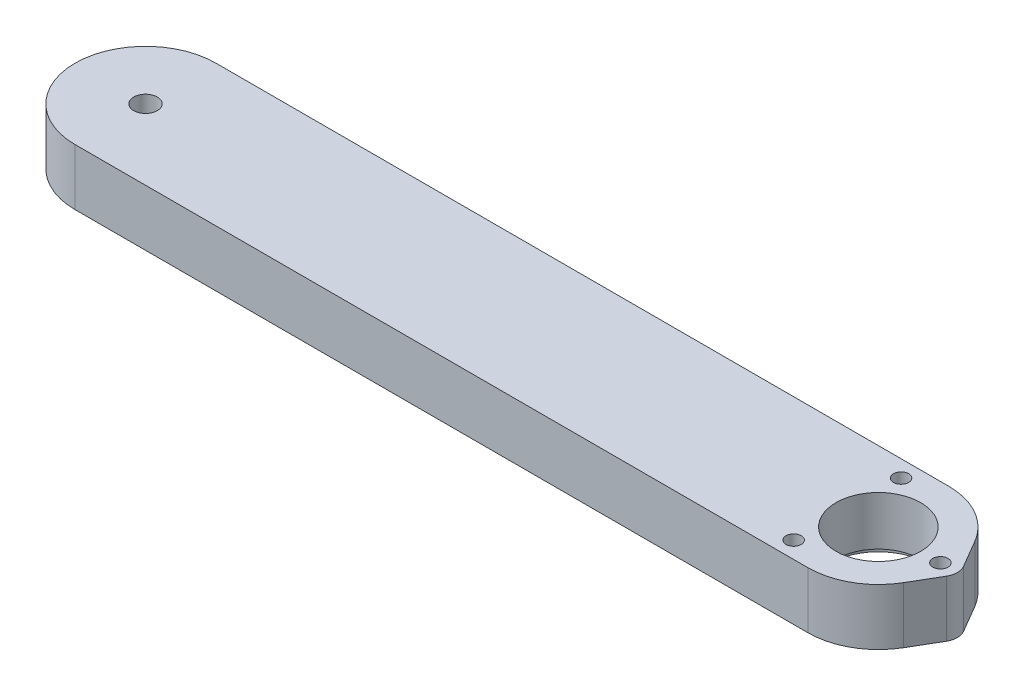
ISO-10303-21;
HEADER;
FILE_DESCRIPTION(('STEP AP214'),'2;1');
FILE_NAME('part.step','',(''),(''),'','','');
FILE_SCHEMA(('AUTOMOTIVE_DESIGN { 1 0 10303 214 1 1 1 1 }'));
ENDSEC;
DATA;
#1=APPLICATION_CONTEXT('core data for automotive mechanical design processes');
#2=APPLICATION_PROTOCOL_DEFINITION('international standard','automotive_design',2000,#1);
#3=PRODUCT_CONTEXT('',#1,'mechanical');
#4=PRODUCT('Part','Part','',(#3));
#5=PRODUCT_RELATED_PRODUCT_CATEGORY('part','',(#4));
#6=PRODUCT_DEFINITION_FORMATION('','',#4);
#7=PRODUCT_DEFINITION_CONTEXT('part definition',#1,'design');
#8=PRODUCT_DEFINITION('design','',#6,#7);
#9=PRODUCT_DEFINITION_SHAPE('','',#8);
#10=(LENGTH_UNIT() NAMED_UNIT(*) SI_UNIT(.MILLI.,.METRE.));
#11=(NAMED_UNIT(*) PLANE_ANGLE_UNIT() SI_UNIT($,.RADIAN.));
#12=(NAMED_UNIT(*) SI_UNIT($,.STERADIAN.) SOLID_ANGLE_UNIT());
#13=UNCERTAINTY_MEASURE_WITH_UNIT(LENGTH_MEASURE(1.E-05),#10,'distance_accuracy_value','');
#14=(GEOMETRIC_REPRESENTATION_CONTEXT(3) GLOBAL_UNCERTAINTY_ASSIGNED_CONTEXT((#13)) GLOBAL_UNIT_ASSIGNED_CONTEXT((#10,
#11,#12)) REPRESENTATION_CONTEXT('',''));
#15=CARTESIAN_POINT('',(0.,0.,0.));
#16=DIRECTION('',(0.,0.,1.));
#17=DIRECTION('',(1.,0.,0.));
#18=AXIS2_PLACEMENT_3D('',#15,#16,#17);
#19=CARTESIAN_POINT('',(65.,10.,0.));
#20=DIRECTION('',(0.,-1.,0.));
#21=DIRECTION('',(0.,0.,-1.));
#22=AXIS2_PLACEMENT_3D('',#19,#20,#21);
#23=CYLINDRICAL_SURFACE('',#22,12.5);
#24=CARTESIAN_POINT('',(65.,10.,0.));
#25=DIRECTION('',(0.,1.,0.));
#26=DIRECTION('',(0.,0.,1.));
#27=AXIS2_PLACEMENT_3D('',#24,#25,#26);
#28=CIRCLE('',#27,12.5);
#29=CARTESIAN_POINT('',(75.7954545454546,10.,-6.30144119682354));
#30=VERTEX_POINT('',#29);
#31=CARTESIAN_POINT('',(65.,10.,-12.5));
#32=VERTEX_POINT('',#31);
#33=EDGE_CURVE('E149',#30,#32,#28,.T.);
#34=ORIENTED_EDGE('',*,*,#33,.F.);
#35=DIRECTION('',(0.,-1.,0.));
#36=VECTOR('',#35,1.);
#37=CARTESIAN_POINT('',(75.7954545454546,23.0039131109965,-6.30144119682354));
#38=LINE('',#37,#36);
#39=CARTESIAN_POINT('',(75.7954545454546,0.,-6.30144119682354));
#40=VERTEX_POINT('',#39);
#41=EDGE_CURVE('E130',#30,#40,#38,.T.);
#42=ORIENTED_EDGE('',*,*,#41,.T.);
#43=CARTESIAN_POINT('',(65.,0.,0.));
#44=DIRECTION('',(0.,1.,0.));
#45=DIRECTION('',(0.,0.,1.));
#46=AXIS2_PLACEMENT_3D('',#43,#44,#45);
#47=CIRCLE('',#46,12.5);
#48=CARTESIAN_POINT('',(65.,0.,-12.5));
#49=VERTEX_POINT('',#48);
#50=EDGE_CURVE('E158',#40,#49,#47,.T.);
#51=ORIENTED_EDGE('',*,*,#50,.T.);
#52=DIRECTION('',(0.,-1.,0.));
#53=VECTOR('',#52,1.);
#54=CARTESIAN_POINT('',(65.,10.,-12.5));
#55=LINE('',#54,#53);
#56=EDGE_CURVE('E164',#32,#49,#55,.T.);
#57=ORIENTED_EDGE('',*,*,#56,.F.);
#58=EDGE_LOOP('',(#34,#42,#51,#57));
#59=FACE_BOUND('',#58,.T.);
#60=ADVANCED_FACE('F37',(#59),#23,.T.);
#61=CARTESIAN_POINT('',(-65.,10.,0.));
#62=DIRECTION('',(0.,-1.,0.));
#63=DIRECTION('',(0.,0.,-1.));
#64=AXIS2_PLACEMENT_3D('',#61,#62,#63);
#65=CYLINDRICAL_SURFACE('',#64,12.5);
#66=CARTESIAN_POINT('',(-65.,0.,0.));
#67=DIRECTION('',(0.,1.,0.));
#68=DIRECTION('',(0.,0.,1.));
#69=AXIS2_PLACEMENT_3D('',#66,#67,#68);
#70=CIRCLE('',#69,12.5);
#71=CARTESIAN_POINT('',(-65.,0.,-12.5));
#72=VERTEX_POINT('',#71);
#73=CARTESIAN_POINT('',(-65.,0.,12.5));
#74=VERTEX_POINT('',#73);
#75=EDGE_CURVE('E145',#72,#74,#70,.T.);
#76=ORIENTED_EDGE('',*,*,#75,.T.);
#77=DIRECTION('',(0.,-1.,0.));
#78=VECTOR('',#77,1.);
#79=CARTESIAN_POINT('',(-65.,10.,12.5));
#80=LINE('',#79,#78);
#81=CARTESIAN_POINT('',(-65.,10.,12.5));
#82=VERTEX_POINT('',#81);
#83=EDGE_CURVE('E11',#82,#74,#80,.T.);
#84=ORIENTED_EDGE('',*,*,#83,.F.);
#85=CARTESIAN_POINT('',(-65.,10.,0.));
#86=DIRECTION('',(0.,1.,0.));
#87=DIRECTION('',(0.,0.,1.));
#88=AXIS2_PLACEMENT_3D('',#85,#86,#87);
#89=CIRCLE('',#88,12.5);
#90=CARTESIAN_POINT('',(-65.,10.,-12.5));
#91=VERTEX_POINT('',#90);
#92=EDGE_CURVE('E146',#91,#82,#89,.T.);
#93=ORIENTED_EDGE('',*,*,#92,.F.);
#94=DIRECTION('',(0.,-1.,0.));
#95=VECTOR('',#94,1.);
#96=CARTESIAN_POINT('',(-65.,10.,-12.5));
#97=LINE('',#96,#95);
#98=EDGE_CURVE('E153',#91,#72,#97,.T.);
#99=ORIENTED_EDGE('',*,*,#98,.T.);
#100=EDGE_LOOP('',(#76,#84,#93,#99));
#101=FACE_BOUND('',#100,.T.);
#102=ADVANCED_FACE('F39',(#101),#65,.T.);
#103=CARTESIAN_POINT('',(-65.,10.,12.5));
#104=DIRECTION('',(0.,0.,-1.));
#105=DIRECTION('',(-1.,0.,0.));
#106=AXIS2_PLACEMENT_3D('',#103,#104,#105);
#107=PLANE('',#106);
#108=DIRECTION('',(1.,0.,0.));
#109=VECTOR('',#108,1.);
#110=CARTESIAN_POINT('',(-65.,0.,12.5));
#111=LINE('',#110,#109);
#112=CARTESIAN_POINT('',(65.,0.,12.5));
#113=VERTEX_POINT('',#112);
#114=EDGE_CURVE('E156',#74,#113,#111,.T.);
#115=ORIENTED_EDGE('',*,*,#114,.T.);
#116=DIRECTION('',(0.,-1.,0.));
#117=VECTOR('',#116,1.);
#118=CARTESIAN_POINT('',(65.,10.,12.5));
#119=LINE('',#118,#117);
#120=CARTESIAN_POINT('',(65.,10.,12.5));
#121=VERTEX_POINT('',#120);
#122=EDGE_CURVE('E46',#121,#113,#119,.T.);
#123=ORIENTED_EDGE('',*,*,#122,.F.);
#124=DIRECTION('',(1.,0.,0.));
#125=VECTOR('',#124,1.);
#126=CARTESIAN_POINT('',(-65.,10.,12.5));
#127=LINE('',#126,#125);
#128=EDGE_CURVE('E90',#82,#121,#127,.T.);
#129=ORIENTED_EDGE('',*,*,#128,.F.);
#130=ORIENTED_EDGE('',*,*,#83,.T.);
#131=EDGE_LOOP('',(#115,#123,#129,#130));
#132=FACE_BOUND('',#131,.T.);
#133=ADVANCED_FACE('F180',(#132),#107,.F.);
#134=CARTESIAN_POINT('',(75.7954545454546,0.,6.30144119682354));
#135=VERTEX_POINT('',#134);
#136=EDGE_CURVE('E159',#113,#135,#47,.T.);
#137=ORIENTED_EDGE('',*,*,#136,.T.);
#138=DIRECTION('',(0.,-1.,0.));
#139=VECTOR('',#138,1.);
#140=CARTESIAN_POINT('',(75.7954545454546,23.0039131109965,6.30144119682354));
#141=LINE('',#140,#139);
#142=CARTESIAN_POINT('',(75.7954545454546,10.,6.30144119682352));
#143=VERTEX_POINT('',#142);
#144=EDGE_CURVE('E140',#143,#135,#141,.T.);
#145=ORIENTED_EDGE('',*,*,#144,.F.);
#146=EDGE_CURVE('E150',#121,#143,#28,.T.);
#147=ORIENTED_EDGE('',*,*,#146,.F.);
#148=ORIENTED_EDGE('',*,*,#122,.T.);
#149=EDGE_LOOP('',(#137,#145,#147,#148));
#150=FACE_BOUND('',#149,.T.);
#151=ADVANCED_FACE('F170',(#150),#23,.T.);
#152=CARTESIAN_POINT('',(-65.,10.,-12.5));
#153=DIRECTION('',(0.,0.,1.));
#154=DIRECTION('',(1.,0.,0.));
#155=AXIS2_PLACEMENT_3D('',#152,#153,#154);
#156=PLANE('',#155);
#157=DIRECTION('',(-1.,0.,0.));
#158=VECTOR('',#157,1.);
#159=CARTESIAN_POINT('',(-65.,0.,-12.5));
#160=LINE('',#159,#158);
#161=EDGE_CURVE('E83',#49,#72,#160,.T.);
#162=ORIENTED_EDGE('',*,*,#161,.T.);
#163=ORIENTED_EDGE('',*,*,#98,.F.);
#164=DIRECTION('',(-1.,0.,0.));
#165=VECTOR('',#164,1.);
#166=CARTESIAN_POINT('',(-65.,10.,-12.5));
#167=LINE('',#166,#165);
#168=EDGE_CURVE('E62',#32,#91,#167,.T.);
#169=ORIENTED_EDGE('',*,*,#168,.F.);
#170=ORIENTED_EDGE('',*,*,#56,.T.);
#171=EDGE_LOOP('',(#162,#163,#169,#170));
#172=FACE_BOUND('',#171,.T.);
#173=ADVANCED_FACE('F186',(#172),#156,.F.);
#174=CARTESIAN_POINT('',(-65.,10.,0.));
#175=DIRECTION('',(0.,1.,0.));
#176=DIRECTION('',(0.,0.,1.));
#177=AXIS2_PLACEMENT_3D('',#174,#175,#176);
#178=PLANE('',#177);
#179=CARTESIAN_POINT('',(-65.,10.,0.));
#180=DIRECTION('',(0.,1.,0.));
#181=DIRECTION('',(0.,0.,1.));
#182=AXIS2_PLACEMENT_3D('',#179,#180,#181);
#183=CIRCLE('',#182,2.1);
#184=CARTESIAN_POINT('',(-65.,10.,2.1));
#185=VERTEX_POINT('',#184);
#186=EDGE_CURVE('E239',#185,#185,#183,.T.);
#187=ORIENTED_EDGE('',*,*,#186,.F.);
#188=EDGE_LOOP('',(#187));
#189=FACE_BOUND('',#188,.T.);
#190=CARTESIAN_POINT('',(59.5,10.,9.52627944162884));
#191=DIRECTION('',(0.,1.,0.));
#192=DIRECTION('',(0.,0.,1.));
#193=AXIS2_PLACEMENT_3D('',#190,#191,#192);
#194=CIRCLE('',#193,1.35);
#195=CARTESIAN_POINT('',(59.5,10.,10.8762794416288));
#196=VERTEX_POINT('',#195);
#197=EDGE_CURVE('E254',#196,#196,#194,.F.);
#198=ORIENTED_EDGE('',*,*,#197,.T.);
#199=EDGE_LOOP('',(#198));
#200=FACE_BOUND('',#199,.T.);
#201=CARTESIAN_POINT('',(76.,10.,0.));
#202=DIRECTION('',(0.,1.,0.));
#203=DIRECTION('',(0.,0.,1.));
#204=AXIS2_PLACEMENT_3D('',#201,#202,#203);
#205=CIRCLE('',#204,1.34999999999999);
#206=CARTESIAN_POINT('',(76.,10.,1.34999999999997));
#207=VERTEX_POINT('',#206);
#208=EDGE_CURVE('E260',#207,#207,#205,.F.);
#209=ORIENTED_EDGE('',*,*,#208,.T.);
#210=EDGE_LOOP('',(#209));
#211=FACE_BOUND('',#210,.T.);
#212=CARTESIAN_POINT('',(59.5,10.,-9.52627944162882));
#213=DIRECTION('',(0.,1.,0.));
#214=DIRECTION('',(0.,0.,1.));
#215=AXIS2_PLACEMENT_3D('',#212,#213,#214);
#216=CIRCLE('',#215,1.35);
#217=CARTESIAN_POINT('',(59.5,10.,-8.17627944162882));
#218=VERTEX_POINT('',#217);
#219=EDGE_CURVE('E243',#218,#218,#216,.F.);
#220=ORIENTED_EDGE('',*,*,#219,.T.);
#221=EDGE_LOOP('',(#220));
#222=FACE_BOUND('',#221,.T.);
#223=CARTESIAN_POINT('',(65.,10.,0.));
#224=DIRECTION('',(0.,1.,0.));
#225=DIRECTION('',(0.,0.,1.));
#226=AXIS2_PLACEMENT_3D('',#223,#224,#225);
#227=CIRCLE('',#226,7.50000000000001);
#228=CARTESIAN_POINT('',(65.,10.,7.50000000000001));
#229=VERTEX_POINT('',#228);
#230=EDGE_CURVE('E270',#229,#229,#227,.T.);
#231=ORIENTED_EDGE('',*,*,#230,.F.);
#232=EDGE_LOOP('',(#231));
#233=FACE_BOUND('',#232,.T.);
#234=ORIENTED_EDGE('',*,*,#146,.T.);
#235=DIRECTION('',(-0.504115295745882,0.,0.863636363636364));
#236=VECTOR('',#235,1.);
#237=CARTESIAN_POINT('',(75.7954545454546,10.,6.30144119682354));
#238=LINE('',#237,#236);
#239=CARTESIAN_POINT('',(78.5909090909091,10.,1.51234588723765));
#240=VERTEX_POINT('',#239);
#241=EDGE_CURVE('E53',#240,#143,#238,.T.);
#242=ORIENTED_EDGE('',*,*,#241,.F.);
#243=CARTESIAN_POINT('',(76.,10.,0.));
#244=DIRECTION('',(0.,1.,0.));
#245=DIRECTION('',(0.,0.,1.));
#246=AXIS2_PLACEMENT_3D('',#243,#244,#245);
#247=CIRCLE('',#246,3.);
#248=CARTESIAN_POINT('',(78.5909090909091,10.,-1.51234588723765));
#249=VERTEX_POINT('',#248);
#250=EDGE_CURVE('E110',#249,#240,#247,.F.);
#251=ORIENTED_EDGE('',*,*,#250,.F.);
#252=DIRECTION('',(0.504115295745882,0.,0.863636363636364));
#253=VECTOR('',#252,1.);
#254=CARTESIAN_POINT('',(75.7954545454546,10.,-6.30144119682354));
#255=LINE('',#254,#253);
#256=EDGE_CURVE('E115',#30,#249,#255,.T.);
#257=ORIENTED_EDGE('',*,*,#256,.F.);
#258=ORIENTED_EDGE('',*,*,#33,.T.);
#259=ORIENTED_EDGE('',*,*,#168,.T.);
#260=ORIENTED_EDGE('',*,*,#92,.T.);
#261=ORIENTED_EDGE('',*,*,#128,.T.);
#262=EDGE_LOOP('',(#234,#242,#251,#257,#258,#259,#260,#261));
#263=FACE_BOUND('',#262,.T.);
#264=ADVANCED_FACE('F113',(#189,#200,#211,#222,#233,#263),#178,.T.);
#265=CARTESIAN_POINT('',(-65.,0.,0.));
#266=DIRECTION('',(0.,1.,0.));
#267=DIRECTION('',(0.,0.,1.));
#268=AXIS2_PLACEMENT_3D('',#265,#266,#267);
#269=PLANE('',#268);
#270=CARTESIAN_POINT('',(-65.,0.,0.));
#271=DIRECTION('',(0.,1.,0.));
#272=DIRECTION('',(0.,0.,1.));
#273=AXIS2_PLACEMENT_3D('',#270,#271,#272);
#274=CIRCLE('',#273,2.1);
#275=CARTESIAN_POINT('',(-65.,0.,2.1));
#276=VERTEX_POINT('',#275);
#277=EDGE_CURVE('E242',#276,#276,#274,.F.);
#278=ORIENTED_EDGE('',*,*,#277,.F.);
#279=EDGE_LOOP('',(#278));
#280=FACE_BOUND('',#279,.T.);
#281=CARTESIAN_POINT('',(59.5,0.,9.52627944162884));
#282=DIRECTION('',(0.,-1.,0.));
#283=DIRECTION('',(0.,0.,-1.));
#284=AXIS2_PLACEMENT_3D('',#281,#282,#283);
#285=CIRCLE('',#284,1.35);
#286=CARTESIAN_POINT('',(59.5,0.,8.17627944162884));
#287=VERTEX_POINT('',#286);
#288=EDGE_CURVE('E250',#287,#287,#285,.T.);
#289=ORIENTED_EDGE('',*,*,#288,.F.);
#290=EDGE_LOOP('',(#289));
#291=FACE_BOUND('',#290,.T.);
#292=CARTESIAN_POINT('',(76.,0.,0.));
#293=DIRECTION('',(0.,-1.,0.));
#294=DIRECTION('',(0.,0.,-1.));
#295=AXIS2_PLACEMENT_3D('',#292,#293,#294);
#296=CIRCLE('',#295,1.34999999999999);
#297=CARTESIAN_POINT('',(76.,0.,-1.35000000000001));
#298=VERTEX_POINT('',#297);
#299=EDGE_CURVE('E257',#298,#298,#296,.T.);
#300=ORIENTED_EDGE('',*,*,#299,.F.);
#301=EDGE_LOOP('',(#300));
#302=FACE_BOUND('',#301,.T.);
#303=CARTESIAN_POINT('',(59.5,0.,-9.52627944162882));
#304=DIRECTION('',(0.,-1.,0.));
#305=DIRECTION('',(0.,0.,-1.));
#306=AXIS2_PLACEMENT_3D('',#303,#304,#305);
#307=CIRCLE('',#306,1.35);
#308=CARTESIAN_POINT('',(59.5,0.,-10.8762794416288));
#309=VERTEX_POINT('',#308);
#310=EDGE_CURVE('E246',#309,#309,#307,.T.);
#311=ORIENTED_EDGE('',*,*,#310,.F.);
#312=EDGE_LOOP('',(#311));
#313=FACE_BOUND('',#312,.T.);
#314=CARTESIAN_POINT('',(65.,0.,0.));
#315=DIRECTION('',(0.,1.,0.));
#316=DIRECTION('',(0.,0.,1.));
#317=AXIS2_PLACEMENT_3D('',#314,#315,#316);
#318=CIRCLE('',#317,8.75000000000001);
#319=CARTESIAN_POINT('',(65.,0.,8.75000000000001));
#320=VERTEX_POINT('',#319);
#321=EDGE_CURVE('E253',#320,#320,#318,.T.);
#322=ORIENTED_EDGE('',*,*,#321,.T.);
#323=EDGE_LOOP('',(#322));
#324=FACE_BOUND('',#323,.T.);
#325=ORIENTED_EDGE('',*,*,#50,.F.);
#326=DIRECTION('',(0.504115295745882,0.,0.863636363636364));
#327=VECTOR('',#326,1.);
#328=CARTESIAN_POINT('',(75.7954545454546,0.,-6.30144119682354));
#329=LINE('',#328,#327);
#330=CARTESIAN_POINT('',(78.5909090909091,0.,-1.51234588723765));
#331=VERTEX_POINT('',#330);
#332=EDGE_CURVE('E138',#40,#331,#329,.T.);
#333=ORIENTED_EDGE('',*,*,#332,.T.);
#334=CARTESIAN_POINT('',(76.,0.,0.));
#335=DIRECTION('',(0.,-1.,0.));
#336=DIRECTION('',(0.,0.,-1.));
#337=AXIS2_PLACEMENT_3D('',#334,#335,#336);
#338=CIRCLE('',#337,3.);
#339=CARTESIAN_POINT('',(78.5909090909091,0.,1.51234588723765));
#340=VERTEX_POINT('',#339);
#341=EDGE_CURVE('E124',#331,#340,#338,.T.);
#342=ORIENTED_EDGE('',*,*,#341,.T.);
#343=DIRECTION('',(-0.504115295745881,0.,0.863636363636364));
#344=VECTOR('',#343,1.);
#345=CARTESIAN_POINT('',(75.7954545454546,0.,6.30144119682354));
#346=LINE('',#345,#344);
#347=EDGE_CURVE('E132',#340,#135,#346,.T.);
#348=ORIENTED_EDGE('',*,*,#347,.T.);
#349=ORIENTED_EDGE('',*,*,#136,.F.);
#350=ORIENTED_EDGE('',*,*,#114,.F.);
#351=ORIENTED_EDGE('',*,*,#75,.F.);
#352=ORIENTED_EDGE('',*,*,#161,.F.);
#353=EDGE_LOOP('',(#325,#333,#342,#348,#349,#350,#351,#352));
#354=FACE_BOUND('',#353,.T.);
#355=ADVANCED_FACE('F173',(#280,#291,#302,#313,#324,#354),#269,.F.);
#356=CARTESIAN_POINT('',(75.7954545454546,23.0039131109965,-6.30144119682354));
#357=DIRECTION('',(0.863636363636364,0.,-0.504115295745882));
#358=DIRECTION('',(-0.504115295745882,0.,-0.863636363636364));
#359=AXIS2_PLACEMENT_3D('',#356,#357,#358);
#360=PLANE('',#359);
#361=ORIENTED_EDGE('',*,*,#41,.F.);
#362=ORIENTED_EDGE('',*,*,#256,.T.);
#363=DIRECTION('',(0.,-1.,0.));
#364=VECTOR('',#363,1.);
#365=CARTESIAN_POINT('',(78.5909090909091,23.0039131109965,-1.51234588723765));
#366=LINE('',#365,#364);
#367=EDGE_CURVE('E119',#249,#331,#366,.T.);
#368=ORIENTED_EDGE('',*,*,#367,.T.);
#369=ORIENTED_EDGE('',*,*,#332,.F.);
#370=EDGE_LOOP('',(#361,#362,#368,#369));
#371=FACE_BOUND('',#370,.T.);
#372=ADVANCED_FACE('F128',(#371),#360,.T.);
#373=CARTESIAN_POINT('',(76.,23.0039131109965,0.));
#374=DIRECTION('',(0.,-1.,0.));
#375=DIRECTION('',(0.,0.,-1.));
#376=AXIS2_PLACEMENT_3D('',#373,#374,#375);
#377=CYLINDRICAL_SURFACE('',#376,3.);
#378=ORIENTED_EDGE('',*,*,#367,.F.);
#379=ORIENTED_EDGE('',*,*,#250,.T.);
#380=DIRECTION('',(0.,-1.,0.));
#381=VECTOR('',#380,1.);
#382=CARTESIAN_POINT('',(78.5909090909091,23.0039131109965,1.51234588723765));
#383=LINE('',#382,#381);
#384=EDGE_CURVE('E118',#240,#340,#383,.T.);
#385=ORIENTED_EDGE('',*,*,#384,.T.);
#386=ORIENTED_EDGE('',*,*,#341,.F.);
#387=EDGE_LOOP('',(#378,#379,#385,#386));
#388=FACE_BOUND('',#387,.T.);
#389=ADVANCED_FACE('F122',(#388),#377,.T.);
#390=CARTESIAN_POINT('',(75.7954545454546,23.0039131109965,6.30144119682354));
#391=DIRECTION('',(0.863636363636364,0.,0.504115295745882));
#392=DIRECTION('',(0.504115295745882,0.,-0.863636363636364));
#393=AXIS2_PLACEMENT_3D('',#390,#391,#392);
#394=PLANE('',#393);
#395=ORIENTED_EDGE('',*,*,#384,.F.);
#396=ORIENTED_EDGE('',*,*,#241,.T.);
#397=ORIENTED_EDGE('',*,*,#144,.T.);
#398=ORIENTED_EDGE('',*,*,#347,.F.);
#399=EDGE_LOOP('',(#395,#396,#397,#398));
#400=FACE_BOUND('',#399,.T.);
#401=ADVANCED_FACE('F176',(#400),#394,.T.);
#402=CARTESIAN_POINT('',(65.,-0.000999999999999265,0.));
#403=DIRECTION('',(0.,1.,0.));
#404=DIRECTION('',(0.,0.,1.));
#405=AXIS2_PLACEMENT_3D('',#402,#403,#404);
#406=CYLINDRICAL_SURFACE('',#405,7.50000000000001);
#407=CARTESIAN_POINT('',(65.,1.3,0.));
#408=DIRECTION('',(0.,1.,0.));
#409=DIRECTION('',(0.,0.,1.));
#410=AXIS2_PLACEMENT_3D('',#407,#408,#409);
#411=CIRCLE('',#410,7.50000000000001);
#412=CARTESIAN_POINT('',(65.,1.3,7.50000000000001));
#413=VERTEX_POINT('',#412);
#414=EDGE_CURVE('E41',#413,#413,#411,.F.);
#415=ORIENTED_EDGE('',*,*,#414,.T.);
#416=EDGE_LOOP('',(#415));
#417=FACE_BOUND('',#416,.T.);
#418=ORIENTED_EDGE('',*,*,#230,.T.);
#419=EDGE_LOOP('',(#418));
#420=FACE_BOUND('',#419,.T.);
#421=ADVANCED_FACE('F207',(#417,#420),#406,.F.);
#422=CARTESIAN_POINT('',(65.,1.3,0.));
#423=DIRECTION('',(0.,1.,0.));
#424=DIRECTION('',(0.,0.,1.));
#425=AXIS2_PLACEMENT_3D('',#422,#423,#424);
#426=PLANE('',#425);
#427=CARTESIAN_POINT('',(65.,1.3,0.));
#428=DIRECTION('',(0.,1.,0.));
#429=DIRECTION('',(0.,0.,1.));
#430=AXIS2_PLACEMENT_3D('',#427,#428,#429);
#431=CIRCLE('',#430,8.75000000000001);
#432=CARTESIAN_POINT('',(65.,1.3,8.75000000000001));
#433=VERTEX_POINT('',#432);
#434=EDGE_CURVE('E265',#433,#433,#431,.T.);
#435=ORIENTED_EDGE('',*,*,#434,.F.);
#436=EDGE_LOOP('',(#435));
#437=FACE_BOUND('',#436,.T.);
#438=ORIENTED_EDGE('',*,*,#414,.F.);
#439=EDGE_LOOP('',(#438));
#440=FACE_BOUND('',#439,.T.);
#441=ADVANCED_FACE('F210',(#437,#440),#426,.F.);
#442=CARTESIAN_POINT('',(65.,1.3,0.));
#443=DIRECTION('',(0.,-1.,0.));
#444=DIRECTION('',(0.,0.,-1.));
#445=AXIS2_PLACEMENT_3D('',#442,#443,#444);
#446=CYLINDRICAL_SURFACE('',#445,8.75000000000001);
#447=ORIENTED_EDGE('',*,*,#434,.T.);
#448=EDGE_LOOP('',(#447));
#449=FACE_BOUND('',#448,.T.);
#450=ORIENTED_EDGE('',*,*,#321,.F.);
#451=EDGE_LOOP('',(#450));
#452=FACE_BOUND('',#451,.T.);
#453=ADVANCED_FACE('F212',(#449,#452),#446,.F.);
#454=CARTESIAN_POINT('',(59.5,10.001,-9.52627944162882));
#455=DIRECTION('',(0.,-1.,0.));
#456=DIRECTION('',(0.,0.,-1.));
#457=AXIS2_PLACEMENT_3D('',#454,#455,#456);
#458=CYLINDRICAL_SURFACE('',#457,1.35);
#459=ORIENTED_EDGE('',*,*,#219,.F.);
#460=EDGE_LOOP('',(#459));
#461=FACE_BOUND('',#460,.T.);
#462=ORIENTED_EDGE('',*,*,#310,.T.);
#463=EDGE_LOOP('',(#462));
#464=FACE_BOUND('',#463,.T.);
#465=ADVANCED_FACE('F215',(#461,#464),#458,.F.);
#466=CARTESIAN_POINT('',(76.,10.001,0.));
#467=DIRECTION('',(0.,-1.,0.));
#468=DIRECTION('',(0.,0.,-1.));
#469=AXIS2_PLACEMENT_3D('',#466,#467,#468);
#470=CYLINDRICAL_SURFACE('',#469,1.34999999999999);
#471=ORIENTED_EDGE('',*,*,#208,.F.);
#472=EDGE_LOOP('',(#471));
#473=FACE_BOUND('',#472,.T.);
#474=ORIENTED_EDGE('',*,*,#299,.T.);
#475=EDGE_LOOP('',(#474));
#476=FACE_BOUND('',#475,.T.);
#477=ADVANCED_FACE('F222',(#473,#476),#470,.F.);
#478=CARTESIAN_POINT('',(59.5,10.001,9.52627944162884));
#479=DIRECTION('',(0.,-1.,0.));
#480=DIRECTION('',(0.,0.,-1.));
#481=AXIS2_PLACEMENT_3D('',#478,#479,#480);
#482=CYLINDRICAL_SURFACE('',#481,1.35);
#483=ORIENTED_EDGE('',*,*,#197,.F.);
#484=EDGE_LOOP('',(#483));
#485=FACE_BOUND('',#484,.T.);
#486=ORIENTED_EDGE('',*,*,#288,.T.);
#487=EDGE_LOOP('',(#486));
#488=FACE_BOUND('',#487,.T.);
#489=ADVANCED_FACE('F226',(#485,#488),#482,.F.);
#490=CARTESIAN_POINT('',(-65.,-0.000999999999999265,0.));
#491=DIRECTION('',(0.,1.,0.));
#492=DIRECTION('',(0.,0.,1.));
#493=AXIS2_PLACEMENT_3D('',#490,#491,#492);
#494=CYLINDRICAL_SURFACE('',#493,2.1);
#495=ORIENTED_EDGE('',*,*,#186,.T.);
#496=EDGE_LOOP('',(#495));
#497=FACE_BOUND('',#496,.T.);
#498=ORIENTED_EDGE('',*,*,#277,.T.);
#499=EDGE_LOOP('',(#498));
#500=FACE_BOUND('',#499,.T.);
#501=ADVANCED_FACE('F230',(#497,#500),#494,.F.);
#502=CLOSED_SHELL('',(#60,#102,#133,#151,#173,#264,#355,#372,#389,#401,#421,#441,#453,#465,#477,
#489,#501));
#503=MANIFOLD_SOLID_BREP('B2',#502);
#504=ADVANCED_BREP_SHAPE_REPRESENTATION('',(#18,#503),#14);
#505=SHAPE_DEFINITION_REPRESENTATION(#9,#504);
ENDSEC;
END-ISO-10303-21;
